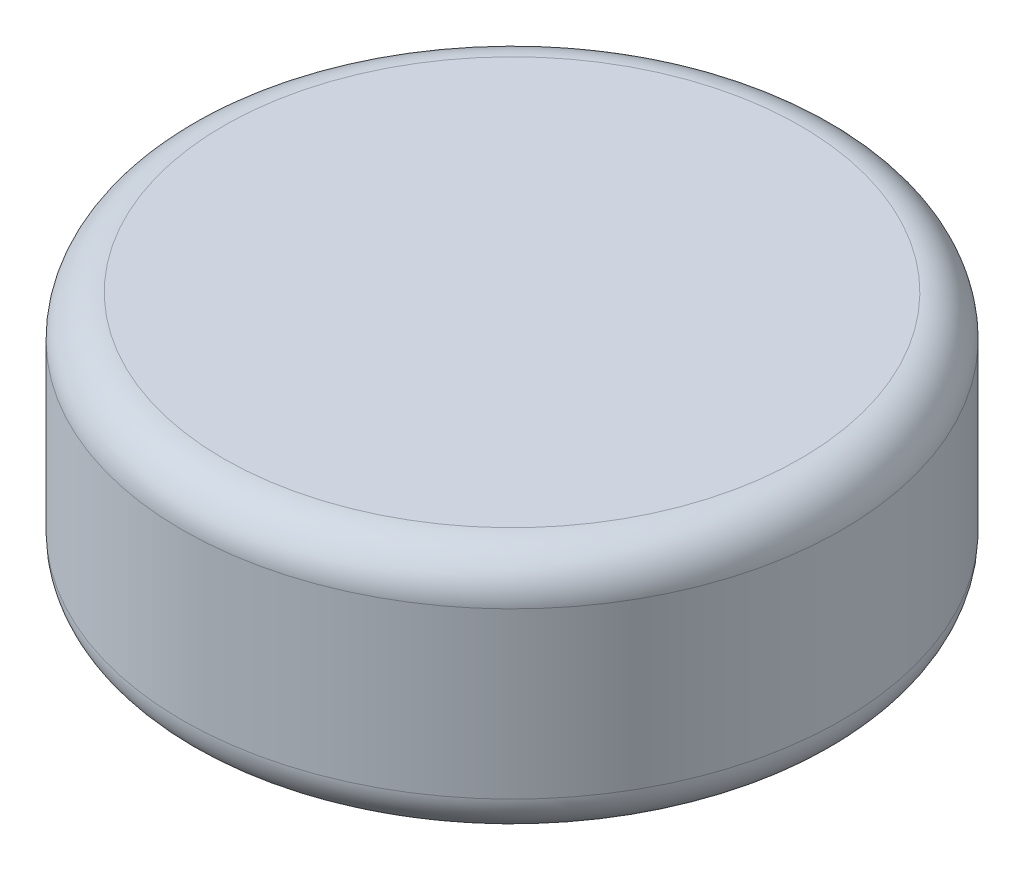
ISO-10303-21;
HEADER;
FILE_DESCRIPTION(('STEP AP214'),'2;1');
FILE_NAME('part.step','',(''),(''),'','','');
FILE_SCHEMA(('AUTOMOTIVE_DESIGN { 1 0 10303 214 1 1 1 1 }'));
ENDSEC;
DATA;
#1=APPLICATION_CONTEXT('core data for automotive mechanical design processes');
#2=APPLICATION_PROTOCOL_DEFINITION('international standard','automotive_design',2000,#1);
#3=PRODUCT_CONTEXT('',#1,'mechanical');
#4=PRODUCT('Part','Part','',(#3));
#5=PRODUCT_RELATED_PRODUCT_CATEGORY('part','',(#4));
#6=PRODUCT_DEFINITION_FORMATION('','',#4);
#7=PRODUCT_DEFINITION_CONTEXT('part definition',#1,'design');
#8=PRODUCT_DEFINITION('design','',#6,#7);
#9=PRODUCT_DEFINITION_SHAPE('','',#8);
#10=(LENGTH_UNIT() NAMED_UNIT(*) SI_UNIT(.MILLI.,.METRE.));
#11=(NAMED_UNIT(*) PLANE_ANGLE_UNIT() SI_UNIT($,.RADIAN.));
#12=(NAMED_UNIT(*) SI_UNIT($,.STERADIAN.) SOLID_ANGLE_UNIT());
#13=UNCERTAINTY_MEASURE_WITH_UNIT(LENGTH_MEASURE(1.E-05),#10,'distance_accuracy_value','');
#14=(GEOMETRIC_REPRESENTATION_CONTEXT(3) GLOBAL_UNCERTAINTY_ASSIGNED_CONTEXT((#13)) GLOBAL_UNIT_ASSIGNED_CONTEXT((#10,
#11,#12)) REPRESENTATION_CONTEXT('',''));
#15=CARTESIAN_POINT('',(0.,0.,0.));
#16=DIRECTION('',(0.,0.,1.));
#17=DIRECTION('',(1.,0.,0.));
#18=AXIS2_PLACEMENT_3D('',#15,#16,#17);
#19=CARTESIAN_POINT('',(0.,3.,0.));
#20=DIRECTION('',(0.,-1.,0.));
#21=DIRECTION('',(0.,0.,-1.));
#22=AXIS2_PLACEMENT_3D('',#19,#20,#21);
#23=CYLINDRICAL_SURFACE('',#22,4.);
#24=CARTESIAN_POINT('',(0.,0.5,0.));
#25=DIRECTION('',(0.,1.,0.));
#26=DIRECTION('',(0.,0.,1.));
#27=AXIS2_PLACEMENT_3D('',#24,#25,#26);
#28=CIRCLE('',#27,4.);
#29=CARTESIAN_POINT('',(0.,0.5,4.00000000000001));
#30=VERTEX_POINT('',#29);
#31=EDGE_CURVE('E45',#30,#30,#28,.T.);
#32=ORIENTED_EDGE('',*,*,#31,.T.);
#33=EDGE_LOOP('',(#32));
#34=FACE_BOUND('',#33,.T.);
#35=CARTESIAN_POINT('',(0.,2.5,0.));
#36=DIRECTION('',(0.,1.,0.));
#37=DIRECTION('',(0.,0.,1.));
#38=AXIS2_PLACEMENT_3D('',#35,#36,#37);
#39=CIRCLE('',#38,4.);
#40=CARTESIAN_POINT('',(0.,2.5,4.00000000000001));
#41=VERTEX_POINT('',#40);
#42=EDGE_CURVE('E49',#41,#41,#39,.F.);
#43=ORIENTED_EDGE('',*,*,#42,.T.);
#44=EDGE_LOOP('',(#43));
#45=FACE_BOUND('',#44,.T.);
#46=ADVANCED_FACE('F34',(#34,#45),#23,.T.);
#47=CARTESIAN_POINT('',(0.,3.,0.));
#48=DIRECTION('',(0.,1.,0.));
#49=DIRECTION('',(0.,0.,1.));
#50=AXIS2_PLACEMENT_3D('',#47,#48,#49);
#51=PLANE('',#50);
#52=CARTESIAN_POINT('',(0.,3.,0.));
#53=DIRECTION('',(0.,1.,0.));
#54=DIRECTION('',(0.,0.,1.));
#55=AXIS2_PLACEMENT_3D('',#52,#53,#54);
#56=CIRCLE('',#55,3.5);
#57=CARTESIAN_POINT('',(0.,3.,3.5));
#58=VERTEX_POINT('',#57);
#59=EDGE_CURVE('E10',#58,#58,#56,.T.);
#60=ORIENTED_EDGE('',*,*,#59,.T.);
#61=EDGE_LOOP('',(#60));
#62=FACE_BOUND('',#61,.T.);
#63=ADVANCED_FACE('F65',(#62),#51,.T.);
#64=CARTESIAN_POINT('',(0.,0.,0.));
#65=DIRECTION('',(0.,1.,0.));
#66=DIRECTION('',(0.,0.,1.));
#67=AXIS2_PLACEMENT_3D('',#64,#65,#66);
#68=PLANE('',#67);
#69=CARTESIAN_POINT('',(0.,0.,0.));
#70=DIRECTION('',(0.,1.,0.));
#71=DIRECTION('',(0.,0.,1.));
#72=AXIS2_PLACEMENT_3D('',#69,#70,#71);
#73=CIRCLE('',#72,3.5);
#74=CARTESIAN_POINT('',(0.,0.,3.5));
#75=VERTEX_POINT('',#74);
#76=EDGE_CURVE('E41',#75,#75,#73,.F.);
#77=ORIENTED_EDGE('',*,*,#76,.T.);
#78=EDGE_LOOP('',(#77));
#79=FACE_BOUND('',#78,.T.);
#80=ADVANCED_FACE('F62',(#79),#68,.F.);
#81=CARTESIAN_POINT('',(0.,0.5,0.));
#82=DIRECTION('',(0.,1.,0.));
#83=DIRECTION('',(0.,0.,1.));
#84=AXIS2_PLACEMENT_3D('',#81,#82,#83);
#85=TOROIDAL_SURFACE('',#84,3.5,0.5);
#86=ORIENTED_EDGE('',*,*,#76,.F.);
#87=EDGE_LOOP('',(#86));
#88=FACE_BOUND('',#87,.T.);
#89=ORIENTED_EDGE('',*,*,#31,.F.);
#90=EDGE_LOOP('',(#89));
#91=FACE_BOUND('',#90,.T.);
#92=ADVANCED_FACE('F58',(#88,#91),#85,.T.);
#93=CARTESIAN_POINT('',(0.,2.5,0.));
#94=DIRECTION('',(0.,1.,0.));
#95=DIRECTION('',(0.,0.,1.));
#96=AXIS2_PLACEMENT_3D('',#93,#94,#95);
#97=TOROIDAL_SURFACE('',#96,3.5,0.5);
#98=ORIENTED_EDGE('',*,*,#42,.F.);
#99=EDGE_LOOP('',(#98));
#100=FACE_BOUND('',#99,.T.);
#101=ORIENTED_EDGE('',*,*,#59,.F.);
#102=EDGE_LOOP('',(#101));
#103=FACE_BOUND('',#102,.T.);
#104=ADVANCED_FACE('F36',(#100,#103),#97,.T.);
#105=CLOSED_SHELL('',(#46,#63,#80,#92,#104));
#106=MANIFOLD_SOLID_BREP('B2',#105);
#107=ADVANCED_BREP_SHAPE_REPRESENTATION('',(#18,#106),#14);
#108=SHAPE_DEFINITION_REPRESENTATION(#9,#107);
ENDSEC;
END-ISO-10303-21;
